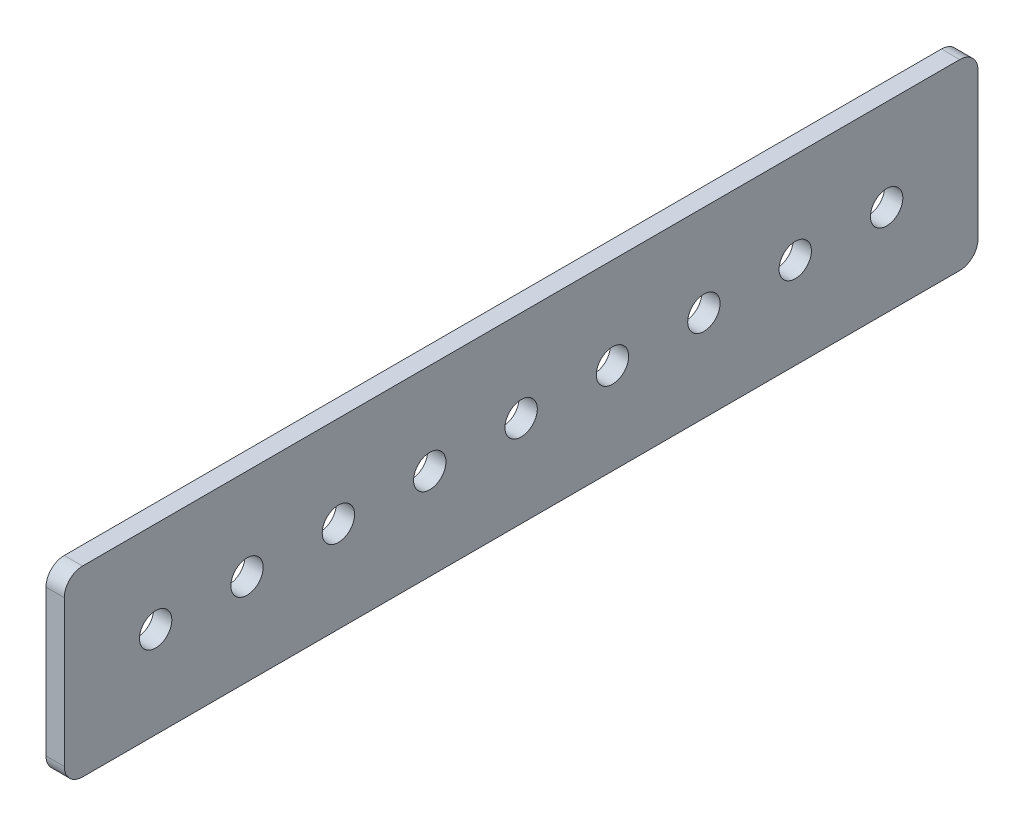
ISO-10303-21;
HEADER;
FILE_DESCRIPTION(('STEP AP214'),'2;1');
FILE_NAME('part.step','',(''),(''),'','','');
FILE_SCHEMA(('AUTOMOTIVE_DESIGN { 1 0 10303 214 1 1 1 1 }'));
ENDSEC;
DATA;
#1=APPLICATION_CONTEXT('core data for automotive mechanical design processes');
#2=APPLICATION_PROTOCOL_DEFINITION('international standard','automotive_design',2000,#1);
#3=PRODUCT_CONTEXT('',#1,'mechanical');
#4=PRODUCT('Part','Part','',(#3));
#5=PRODUCT_RELATED_PRODUCT_CATEGORY('part','',(#4));
#6=PRODUCT_DEFINITION_FORMATION('','',#4);
#7=PRODUCT_DEFINITION_CONTEXT('part definition',#1,'design');
#8=PRODUCT_DEFINITION('design','',#6,#7);
#9=PRODUCT_DEFINITION_SHAPE('','',#8);
#10=(LENGTH_UNIT() NAMED_UNIT(*) SI_UNIT(.MILLI.,.METRE.));
#11=(NAMED_UNIT(*) PLANE_ANGLE_UNIT() SI_UNIT($,.RADIAN.));
#12=(NAMED_UNIT(*) SI_UNIT($,.STERADIAN.) SOLID_ANGLE_UNIT());
#13=UNCERTAINTY_MEASURE_WITH_UNIT(LENGTH_MEASURE(1.E-05),#10,'distance_accuracy_value','');
#14=(GEOMETRIC_REPRESENTATION_CONTEXT(3) GLOBAL_UNCERTAINTY_ASSIGNED_CONTEXT((#13)) GLOBAL_UNIT_ASSIGNED_CONTEXT((#10,
#11,#12)) REPRESENTATION_CONTEXT('',''));
#15=CARTESIAN_POINT('',(0.,0.,0.));
#16=DIRECTION('',(0.,0.,1.));
#17=DIRECTION('',(1.,0.,0.));
#18=AXIS2_PLACEMENT_3D('',#15,#16,#17);
#19=CARTESIAN_POINT('',(2.54,-23.7489999999995,63.4999999999999));
#20=DIRECTION('',(0.,1.,0.));
#21=DIRECTION('',(0.,0.,1.));
#22=AXIS2_PLACEMENT_3D('',#19,#20,#21);
#23=PLANE('',#22);
#24=DIRECTION('',(0.,0.,-1.));
#25=VECTOR('',#24,1.);
#26=CARTESIAN_POINT('',(2.54,-23.7489999999995,63.4999999999999));
#27=LINE('',#26,#25);
#28=CARTESIAN_POINT('',(2.54,-23.7489999999995,60.9599999999999));
#29=VERTEX_POINT('',#28);
#30=CARTESIAN_POINT('',(2.54,-23.7489999999995,-60.9600000000001));
#31=VERTEX_POINT('',#30);
#32=EDGE_CURVE('E129',#29,#31,#27,.T.);
#33=ORIENTED_EDGE('',*,*,#32,.F.);
#34=DIRECTION('',(-1.,0.,0.));
#35=VECTOR('',#34,1.);
#36=CARTESIAN_POINT('',(0.,-23.7489999999995,60.9599999999999));
#37=LINE('',#36,#35);
#38=CARTESIAN_POINT('',(0.,-23.7489999999995,60.9599999999999));
#39=VERTEX_POINT('',#38);
#40=EDGE_CURVE('E159',#29,#39,#37,.T.);
#41=ORIENTED_EDGE('',*,*,#40,.T.);
#42=DIRECTION('',(0.,0.,-1.));
#43=VECTOR('',#42,1.);
#44=CARTESIAN_POINT('',(0.,-23.7489999999995,63.4999999999999));
#45=LINE('',#44,#43);
#46=CARTESIAN_POINT('',(0.,-23.7489999999995,-60.9600000000001));
#47=VERTEX_POINT('',#46);
#48=EDGE_CURVE('E112',#39,#47,#45,.T.);
#49=ORIENTED_EDGE('',*,*,#48,.T.);
#50=DIRECTION('',(-1.,0.,0.));
#51=VECTOR('',#50,1.);
#52=CARTESIAN_POINT('',(2.54,-23.7489999999995,-60.9600000000001));
#53=LINE('',#52,#51);
#54=EDGE_CURVE('E157',#47,#31,#53,.F.);
#55=ORIENTED_EDGE('',*,*,#54,.T.);
#56=EDGE_LOOP('',(#33,#41,#49,#55));
#57=FACE_BOUND('',#56,.T.);
#58=ADVANCED_FACE('F41',(#57),#23,.F.);
#59=CARTESIAN_POINT('',(2.54,-23.7489999999995,-63.5000000000001));
#60=DIRECTION('',(0.,0.,1.));
#61=DIRECTION('',(0.,-1.,0.));
#62=AXIS2_PLACEMENT_3D('',#59,#60,#61);
#63=PLANE('',#62);
#64=DIRECTION('',(0.,1.,0.));
#65=VECTOR('',#64,1.);
#66=CARTESIAN_POINT('',(2.54,-23.7489999999995,-63.5000000000001));
#67=LINE('',#66,#65);
#68=CARTESIAN_POINT('',(2.54,-21.2089999999995,-63.5000000000001));
#69=VERTEX_POINT('',#68);
#70=CARTESIAN_POINT('',(2.54,-0.888999999999522,-63.5000000000001));
#71=VERTEX_POINT('',#70);
#72=EDGE_CURVE('E164',#69,#71,#67,.T.);
#73=ORIENTED_EDGE('',*,*,#72,.F.);
#74=DIRECTION('',(-1.,0.,0.));
#75=VECTOR('',#74,1.);
#76=CARTESIAN_POINT('',(2.54,-21.2089999999995,-63.5000000000001));
#77=LINE('',#76,#75);
#78=CARTESIAN_POINT('',(0.,-21.2089999999995,-63.5000000000001));
#79=VERTEX_POINT('',#78);
#80=EDGE_CURVE('E11',#69,#79,#77,.T.);
#81=ORIENTED_EDGE('',*,*,#80,.T.);
#82=DIRECTION('',(0.,1.,0.));
#83=VECTOR('',#82,1.);
#84=CARTESIAN_POINT('',(0.,-23.7489999999995,-63.5000000000001));
#85=LINE('',#84,#83);
#86=CARTESIAN_POINT('',(0.,-0.888999999999522,-63.5000000000001));
#87=VERTEX_POINT('',#86);
#88=EDGE_CURVE('E178',#79,#87,#85,.T.);
#89=ORIENTED_EDGE('',*,*,#88,.T.);
#90=DIRECTION('',(-1.,0.,0.));
#91=VECTOR('',#90,1.);
#92=CARTESIAN_POINT('',(2.54,-0.888999999999515,-63.5000000000001));
#93=LINE('',#92,#91);
#94=EDGE_CURVE('E49',#87,#71,#93,.F.);
#95=ORIENTED_EDGE('',*,*,#94,.T.);
#96=EDGE_LOOP('',(#73,#81,#89,#95));
#97=FACE_BOUND('',#96,.T.);
#98=ADVANCED_FACE('F198',(#97),#63,.F.);
#99=CARTESIAN_POINT('',(2.54,1.65100000000048,-63.5000000000001));
#100=DIRECTION('',(0.,-1.,0.));
#101=DIRECTION('',(0.,0.,-1.));
#102=AXIS2_PLACEMENT_3D('',#99,#100,#101);
#103=PLANE('',#102);
#104=DIRECTION('',(0.,0.,1.));
#105=VECTOR('',#104,1.);
#106=CARTESIAN_POINT('',(0.,1.65100000000048,-63.5000000000001));
#107=LINE('',#106,#105);
#108=CARTESIAN_POINT('',(0.,1.65100000000048,-60.9600000000001));
#109=VERTEX_POINT('',#108);
#110=CARTESIAN_POINT('',(0.,1.65100000000048,60.9599999999999));
#111=VERTEX_POINT('',#110);
#112=EDGE_CURVE('E130',#109,#111,#107,.T.);
#113=ORIENTED_EDGE('',*,*,#112,.T.);
#114=DIRECTION('',(-1.,0.,0.));
#115=VECTOR('',#114,1.);
#116=CARTESIAN_POINT('',(2.54,1.65100000000048,60.9599999999999));
#117=LINE('',#116,#115);
#118=CARTESIAN_POINT('',(2.54,1.65100000000048,60.9599999999999));
#119=VERTEX_POINT('',#118);
#120=EDGE_CURVE('E149',#111,#119,#117,.F.);
#121=ORIENTED_EDGE('',*,*,#120,.T.);
#122=DIRECTION('',(0.,0.,1.));
#123=VECTOR('',#122,1.);
#124=CARTESIAN_POINT('',(2.54,1.65100000000048,-63.5000000000001));
#125=LINE('',#124,#123);
#126=CARTESIAN_POINT('',(2.54,1.65100000000048,-60.9600000000001));
#127=VERTEX_POINT('',#126);
#128=EDGE_CURVE('E139',#127,#119,#125,.T.);
#129=ORIENTED_EDGE('',*,*,#128,.F.);
#130=DIRECTION('',(-1.,0.,0.));
#131=VECTOR('',#130,1.);
#132=CARTESIAN_POINT('',(2.54,1.65100000000048,-60.9600000000001));
#133=LINE('',#132,#131);
#134=EDGE_CURVE('E146',#127,#109,#133,.T.);
#135=ORIENTED_EDGE('',*,*,#134,.T.);
#136=EDGE_LOOP('',(#113,#121,#129,#135));
#137=FACE_BOUND('',#136,.T.);
#138=ADVANCED_FACE('F188',(#137),#103,.F.);
#139=CARTESIAN_POINT('',(2.54,-23.7489999999995,63.4999999999999));
#140=DIRECTION('',(0.,0.,1.));
#141=DIRECTION('',(1.,0.,0.));
#142=AXIS2_PLACEMENT_3D('',#139,#140,#141);
#143=PLANE('',#142);
#144=DIRECTION('',(0.,1.,0.));
#145=VECTOR('',#144,1.);
#146=CARTESIAN_POINT('',(2.54,-23.7489999999995,63.4999999999999));
#147=LINE('',#146,#145);
#148=CARTESIAN_POINT('',(2.54,-21.2089999999995,63.4999999999999));
#149=VERTEX_POINT('',#148);
#150=CARTESIAN_POINT('',(2.54,-0.888999999999526,63.4999999999999));
#151=VERTEX_POINT('',#150);
#152=EDGE_CURVE('E135',#149,#151,#147,.T.);
#153=ORIENTED_EDGE('',*,*,#152,.T.);
#154=DIRECTION('',(-1.,0.,0.));
#155=VECTOR('',#154,1.);
#156=CARTESIAN_POINT('',(0.,-0.888999999999519,63.4999999999999));
#157=LINE('',#156,#155);
#158=CARTESIAN_POINT('',(0.,-0.888999999999526,63.4999999999999));
#159=VERTEX_POINT('',#158);
#160=EDGE_CURVE('E127',#151,#159,#157,.T.);
#161=ORIENTED_EDGE('',*,*,#160,.T.);
#162=DIRECTION('',(0.,1.,0.));
#163=VECTOR('',#162,1.);
#164=CARTESIAN_POINT('',(0.,-23.7489999999995,63.4999999999999));
#165=LINE('',#164,#163);
#166=CARTESIAN_POINT('',(0.,-21.2089999999995,63.4999999999999));
#167=VERTEX_POINT('',#166);
#168=EDGE_CURVE('E110',#167,#159,#165,.T.);
#169=ORIENTED_EDGE('',*,*,#168,.F.);
#170=DIRECTION('',(-1.,0.,0.));
#171=VECTOR('',#170,1.);
#172=CARTESIAN_POINT('',(2.54,-21.2089999999995,63.4999999999999));
#173=LINE('',#172,#171);
#174=EDGE_CURVE('E124',#167,#149,#173,.F.);
#175=ORIENTED_EDGE('',*,*,#174,.T.);
#176=EDGE_LOOP('',(#153,#161,#169,#175));
#177=FACE_BOUND('',#176,.T.);
#178=ADVANCED_FACE('F123',(#177),#143,.T.);
#179=CARTESIAN_POINT('',(2.54,0.,0.));
#180=DIRECTION('',(1.,0.,0.));
#181=DIRECTION('',(0.,0.,-1.));
#182=AXIS2_PLACEMENT_3D('',#179,#180,#181);
#183=PLANE('',#182);
#184=CARTESIAN_POINT('',(2.54,-11.0489999999995,-50.8000000000002));
#185=DIRECTION('',(-1.,0.,0.));
#186=DIRECTION('',(0.,0.,1.));
#187=AXIS2_PLACEMENT_3D('',#184,#185,#186);
#188=CIRCLE('',#187,2.2479);
#189=CARTESIAN_POINT('',(2.54,-11.0489999999995,-48.5521000000002));
#190=VERTEX_POINT('',#189);
#191=EDGE_CURVE('E458',#190,#190,#188,.T.);
#192=ORIENTED_EDGE('',*,*,#191,.T.);
#193=EDGE_LOOP('',(#192));
#194=FACE_BOUND('',#193,.T.);
#195=CARTESIAN_POINT('',(2.54,-11.0489999999995,-25.4000000000002));
#196=DIRECTION('',(-1.,0.,0.));
#197=DIRECTION('',(0.,0.,1.));
#198=AXIS2_PLACEMENT_3D('',#195,#196,#197);
#199=CIRCLE('',#198,2.2479);
#200=CARTESIAN_POINT('',(2.54,-11.0489999999995,-23.1521000000002));
#201=VERTEX_POINT('',#200);
#202=EDGE_CURVE('E452',#201,#201,#199,.T.);
#203=ORIENTED_EDGE('',*,*,#202,.T.);
#204=EDGE_LOOP('',(#203));
#205=FACE_BOUND('',#204,.T.);
#206=CARTESIAN_POINT('',(2.54,-11.0489999999995,-38.1000000000002));
#207=DIRECTION('',(-1.,0.,0.));
#208=DIRECTION('',(0.,0.,1.));
#209=AXIS2_PLACEMENT_3D('',#206,#207,#208);
#210=CIRCLE('',#209,2.2479);
#211=CARTESIAN_POINT('',(2.54,-11.0489999999995,-35.8521000000002));
#212=VERTEX_POINT('',#211);
#213=EDGE_CURVE('E446',#212,#212,#210,.T.);
#214=ORIENTED_EDGE('',*,*,#213,.T.);
#215=EDGE_LOOP('',(#214));
#216=FACE_BOUND('',#215,.T.);
#217=CARTESIAN_POINT('',(2.54,-11.0489999999995,-1.0321604682062E-13));
#218=DIRECTION('',(-1.,0.,0.));
#219=DIRECTION('',(0.,0.,1.));
#220=AXIS2_PLACEMENT_3D('',#217,#218,#219);
#221=CIRCLE('',#220,2.2479);
#222=CARTESIAN_POINT('',(2.54,-11.0489999999995,2.24789999999989));
#223=VERTEX_POINT('',#222);
#224=EDGE_CURVE('E440',#223,#223,#221,.T.);
#225=ORIENTED_EDGE('',*,*,#224,.T.);
#226=EDGE_LOOP('',(#225));
#227=FACE_BOUND('',#226,.T.);
#228=CARTESIAN_POINT('',(2.54,-11.0489999999995,25.3999999999999));
#229=DIRECTION('',(-1.,0.,0.));
#230=DIRECTION('',(0.,0.,1.));
#231=AXIS2_PLACEMENT_3D('',#228,#229,#230);
#232=CIRCLE('',#231,2.2479);
#233=CARTESIAN_POINT('',(2.54,-11.0489999999995,27.6478999999999));
#234=VERTEX_POINT('',#233);
#235=EDGE_CURVE('E436',#234,#234,#232,.T.);
#236=ORIENTED_EDGE('',*,*,#235,.T.);
#237=EDGE_LOOP('',(#236));
#238=FACE_BOUND('',#237,.T.);
#239=CARTESIAN_POINT('',(2.54,-11.0489999999995,50.7999999999999));
#240=DIRECTION('',(-1.,0.,0.));
#241=DIRECTION('',(0.,0.,1.));
#242=AXIS2_PLACEMENT_3D('',#239,#240,#241);
#243=CIRCLE('',#242,2.2479);
#244=CARTESIAN_POINT('',(2.54,-11.0489999999995,53.0478999999998));
#245=VERTEX_POINT('',#244);
#246=EDGE_CURVE('E432',#245,#245,#243,.T.);
#247=ORIENTED_EDGE('',*,*,#246,.T.);
#248=EDGE_LOOP('',(#247));
#249=FACE_BOUND('',#248,.T.);
#250=CARTESIAN_POINT('',(2.54,-11.0489999999995,-12.7000000000002));
#251=DIRECTION('',(-1.,0.,0.));
#252=DIRECTION('',(0.,0.,1.));
#253=AXIS2_PLACEMENT_3D('',#250,#251,#252);
#254=CIRCLE('',#253,2.2479);
#255=CARTESIAN_POINT('',(2.54,-11.0489999999995,-10.4521000000002));
#256=VERTEX_POINT('',#255);
#257=EDGE_CURVE('E426',#256,#256,#254,.T.);
#258=ORIENTED_EDGE('',*,*,#257,.T.);
#259=EDGE_LOOP('',(#258));
#260=FACE_BOUND('',#259,.T.);
#261=CARTESIAN_POINT('',(2.54,-11.0489999999995,12.6999999999998));
#262=DIRECTION('',(-1.,0.,0.));
#263=DIRECTION('',(0.,0.,1.));
#264=AXIS2_PLACEMENT_3D('',#261,#262,#263);
#265=CIRCLE('',#264,2.2479);
#266=CARTESIAN_POINT('',(2.54,-11.0489999999995,14.9478999999998));
#267=VERTEX_POINT('',#266);
#268=EDGE_CURVE('E418',#267,#267,#265,.T.);
#269=ORIENTED_EDGE('',*,*,#268,.T.);
#270=EDGE_LOOP('',(#269));
#271=FACE_BOUND('',#270,.T.);
#272=CARTESIAN_POINT('',(2.54,-11.0489999999995,38.0999999999998));
#273=DIRECTION('',(-1.,0.,0.));
#274=DIRECTION('',(0.,0.,1.));
#275=AXIS2_PLACEMENT_3D('',#272,#273,#274);
#276=CIRCLE('',#275,2.2479);
#277=CARTESIAN_POINT('',(2.54,-11.0489999999995,40.3478999999998));
#278=VERTEX_POINT('',#277);
#279=EDGE_CURVE('E171',#278,#278,#276,.T.);
#280=ORIENTED_EDGE('',*,*,#279,.T.);
#281=EDGE_LOOP('',(#280));
#282=FACE_BOUND('',#281,.T.);
#283=ORIENTED_EDGE('',*,*,#128,.T.);
#284=CARTESIAN_POINT('',(2.54,-0.888999999999519,60.9599999999999));
#285=DIRECTION('',(1.,0.,0.));
#286=DIRECTION('',(0.,0.,-1.));
#287=AXIS2_PLACEMENT_3D('',#284,#285,#286);
#288=CIRCLE('',#287,2.54);
#289=EDGE_CURVE('E155',#119,#151,#288,.T.);
#290=ORIENTED_EDGE('',*,*,#289,.T.);
#291=ORIENTED_EDGE('',*,*,#152,.F.);
#292=CARTESIAN_POINT('',(2.54,-21.2089999999995,60.9599999999999));
#293=DIRECTION('',(1.,0.,0.));
#294=DIRECTION('',(0.,0.,-1.));
#295=AXIS2_PLACEMENT_3D('',#292,#293,#294);
#296=CIRCLE('',#295,2.54);
#297=EDGE_CURVE('E134',#149,#29,#296,.T.);
#298=ORIENTED_EDGE('',*,*,#297,.T.);
#299=ORIENTED_EDGE('',*,*,#32,.T.);
#300=CARTESIAN_POINT('',(2.54,-21.2089999999995,-60.9600000000001));
#301=DIRECTION('',(1.,0.,0.));
#302=DIRECTION('',(0.,0.,-1.));
#303=AXIS2_PLACEMENT_3D('',#300,#301,#302);
#304=CIRCLE('',#303,2.54);
#305=EDGE_CURVE('E62',#31,#69,#304,.T.);
#306=ORIENTED_EDGE('',*,*,#305,.T.);
#307=ORIENTED_EDGE('',*,*,#72,.T.);
#308=CARTESIAN_POINT('',(2.54,-0.888999999999518,-60.9600000000001));
#309=DIRECTION('',(1.,0.,0.));
#310=DIRECTION('',(0.,0.,-1.));
#311=AXIS2_PLACEMENT_3D('',#308,#309,#310);
#312=CIRCLE('',#311,2.54);
#313=EDGE_CURVE('E151',#71,#127,#312,.T.);
#314=ORIENTED_EDGE('',*,*,#313,.T.);
#315=EDGE_LOOP('',(#283,#290,#291,#298,#299,#306,#307,#314));
#316=FACE_BOUND('',#315,.T.);
#317=ADVANCED_FACE('F194',(#194,#205,#216,#227,#238,#249,#260,#271,#282,#316),#183,.T.);
#318=CARTESIAN_POINT('',(0.,0.,0.));
#319=DIRECTION('',(1.,0.,0.));
#320=DIRECTION('',(0.,0.,-1.));
#321=AXIS2_PLACEMENT_3D('',#318,#319,#320);
#322=PLANE('',#321);
#323=CARTESIAN_POINT('',(0.,-11.0489999999995,-50.8000000000002));
#324=DIRECTION('',(-1.,0.,0.));
#325=DIRECTION('',(0.,0.,1.));
#326=AXIS2_PLACEMENT_3D('',#323,#324,#325);
#327=CIRCLE('',#326,2.24789999999999);
#328=CARTESIAN_POINT('',(0.,-11.0489999999995,-48.5521000000002));
#329=VERTEX_POINT('',#328);
#330=EDGE_CURVE('E385',#329,#329,#327,.T.);
#331=ORIENTED_EDGE('',*,*,#330,.F.);
#332=EDGE_LOOP('',(#331));
#333=FACE_BOUND('',#332,.T.);
#334=CARTESIAN_POINT('',(0.,-11.0489999999995,-25.4000000000002));
#335=DIRECTION('',(-1.,0.,0.));
#336=DIRECTION('',(0.,0.,1.));
#337=AXIS2_PLACEMENT_3D('',#334,#335,#336);
#338=CIRCLE('',#337,2.24789999999999);
#339=CARTESIAN_POINT('',(0.,-11.0489999999995,-23.1521000000002));
#340=VERTEX_POINT('',#339);
#341=EDGE_CURVE('E389',#340,#340,#338,.T.);
#342=ORIENTED_EDGE('',*,*,#341,.F.);
#343=EDGE_LOOP('',(#342));
#344=FACE_BOUND('',#343,.T.);
#345=CARTESIAN_POINT('',(0.,-11.0489999999995,-38.1000000000002));
#346=DIRECTION('',(-1.,0.,0.));
#347=DIRECTION('',(0.,0.,1.));
#348=AXIS2_PLACEMENT_3D('',#345,#346,#347);
#349=CIRCLE('',#348,2.24789999999999);
#350=CARTESIAN_POINT('',(0.,-11.0489999999995,-35.8521000000002));
#351=VERTEX_POINT('',#350);
#352=EDGE_CURVE('E393',#351,#351,#349,.T.);
#353=ORIENTED_EDGE('',*,*,#352,.F.);
#354=EDGE_LOOP('',(#353));
#355=FACE_BOUND('',#354,.T.);
#356=CARTESIAN_POINT('',(0.,-11.0489999999995,-1.0321604682062E-13));
#357=DIRECTION('',(-1.,0.,0.));
#358=DIRECTION('',(0.,0.,1.));
#359=AXIS2_PLACEMENT_3D('',#356,#357,#358);
#360=CIRCLE('',#359,2.24789999999999);
#361=CARTESIAN_POINT('',(0.,-11.0489999999995,2.24789999999988));
#362=VERTEX_POINT('',#361);
#363=EDGE_CURVE('E397',#362,#362,#360,.T.);
#364=ORIENTED_EDGE('',*,*,#363,.F.);
#365=EDGE_LOOP('',(#364));
#366=FACE_BOUND('',#365,.T.);
#367=CARTESIAN_POINT('',(0.,-11.0489999999995,25.3999999999999));
#368=DIRECTION('',(-1.,0.,0.));
#369=DIRECTION('',(0.,0.,1.));
#370=AXIS2_PLACEMENT_3D('',#367,#368,#369);
#371=CIRCLE('',#370,2.24789999999999);
#372=CARTESIAN_POINT('',(0.,-11.0489999999995,27.6478999999999));
#373=VERTEX_POINT('',#372);
#374=EDGE_CURVE('E401',#373,#373,#371,.T.);
#375=ORIENTED_EDGE('',*,*,#374,.F.);
#376=EDGE_LOOP('',(#375));
#377=FACE_BOUND('',#376,.T.);
#378=CARTESIAN_POINT('',(0.,-11.0489999999995,50.7999999999999));
#379=DIRECTION('',(-1.,0.,0.));
#380=DIRECTION('',(0.,0.,1.));
#381=AXIS2_PLACEMENT_3D('',#378,#379,#380);
#382=CIRCLE('',#381,2.24789999999999);
#383=CARTESIAN_POINT('',(0.,-11.0489999999995,53.0478999999998));
#384=VERTEX_POINT('',#383);
#385=EDGE_CURVE('E405',#384,#384,#382,.T.);
#386=ORIENTED_EDGE('',*,*,#385,.F.);
#387=EDGE_LOOP('',(#386));
#388=FACE_BOUND('',#387,.T.);
#389=CARTESIAN_POINT('',(0.,-11.0489999999995,-12.7000000000002));
#390=DIRECTION('',(-1.,0.,0.));
#391=DIRECTION('',(0.,0.,1.));
#392=AXIS2_PLACEMENT_3D('',#389,#390,#391);
#393=CIRCLE('',#392,2.24789999999999);
#394=CARTESIAN_POINT('',(0.,-11.0489999999995,-10.4521000000002));
#395=VERTEX_POINT('',#394);
#396=EDGE_CURVE('E409',#395,#395,#393,.T.);
#397=ORIENTED_EDGE('',*,*,#396,.F.);
#398=EDGE_LOOP('',(#397));
#399=FACE_BOUND('',#398,.T.);
#400=CARTESIAN_POINT('',(0.,-11.0489999999995,12.6999999999998));
#401=DIRECTION('',(-1.,0.,0.));
#402=DIRECTION('',(0.,0.,1.));
#403=AXIS2_PLACEMENT_3D('',#400,#401,#402);
#404=CIRCLE('',#403,2.24789999999999);
#405=CARTESIAN_POINT('',(0.,-11.0489999999995,14.9478999999998));
#406=VERTEX_POINT('',#405);
#407=EDGE_CURVE('E413',#406,#406,#404,.T.);
#408=ORIENTED_EDGE('',*,*,#407,.F.);
#409=EDGE_LOOP('',(#408));
#410=FACE_BOUND('',#409,.T.);
#411=CARTESIAN_POINT('',(0.,-11.0489999999995,38.0999999999998));
#412=DIRECTION('',(-1.,0.,0.));
#413=DIRECTION('',(0.,0.,1.));
#414=AXIS2_PLACEMENT_3D('',#411,#412,#413);
#415=CIRCLE('',#414,2.24789999999999);
#416=CARTESIAN_POINT('',(0.,-11.0489999999995,40.3478999999998));
#417=VERTEX_POINT('',#416);
#418=EDGE_CURVE('E416',#417,#417,#415,.T.);
#419=ORIENTED_EDGE('',*,*,#418,.F.);
#420=EDGE_LOOP('',(#419));
#421=FACE_BOUND('',#420,.T.);
#422=ORIENTED_EDGE('',*,*,#168,.T.);
#423=CARTESIAN_POINT('',(0.,-0.888999999999519,60.9599999999999));
#424=DIRECTION('',(1.,0.,0.));
#425=DIRECTION('',(0.,0.,-1.));
#426=AXIS2_PLACEMENT_3D('',#423,#424,#425);
#427=CIRCLE('',#426,2.54);
#428=EDGE_CURVE('E117',#159,#111,#427,.F.);
#429=ORIENTED_EDGE('',*,*,#428,.T.);
#430=ORIENTED_EDGE('',*,*,#112,.F.);
#431=CARTESIAN_POINT('',(0.,-0.888999999999518,-60.9600000000001));
#432=DIRECTION('',(1.,0.,0.));
#433=DIRECTION('',(0.,0.,-1.));
#434=AXIS2_PLACEMENT_3D('',#431,#432,#433);
#435=CIRCLE('',#434,2.54);
#436=EDGE_CURVE('E137',#109,#87,#435,.F.);
#437=ORIENTED_EDGE('',*,*,#436,.T.);
#438=ORIENTED_EDGE('',*,*,#88,.F.);
#439=CARTESIAN_POINT('',(0.,-21.2089999999995,-60.9600000000001));
#440=DIRECTION('',(1.,0.,0.));
#441=DIRECTION('',(0.,0.,-1.));
#442=AXIS2_PLACEMENT_3D('',#439,#440,#441);
#443=CIRCLE('',#442,2.54);
#444=EDGE_CURVE('E118',#79,#47,#443,.F.);
#445=ORIENTED_EDGE('',*,*,#444,.T.);
#446=ORIENTED_EDGE('',*,*,#48,.F.);
#447=CARTESIAN_POINT('',(0.,-21.2089999999995,60.9599999999999));
#448=DIRECTION('',(1.,0.,0.));
#449=DIRECTION('',(0.,0.,-1.));
#450=AXIS2_PLACEMENT_3D('',#447,#448,#449);
#451=CIRCLE('',#450,2.54);
#452=EDGE_CURVE('E107',#39,#167,#451,.F.);
#453=ORIENTED_EDGE('',*,*,#452,.T.);
#454=EDGE_LOOP('',(#422,#429,#430,#437,#438,#445,#446,#453));
#455=FACE_BOUND('',#454,.T.);
#456=ADVANCED_FACE('F109',(#333,#344,#355,#366,#377,#388,#399,#410,#421,#455),#322,.F.);
#457=CARTESIAN_POINT('',(0.,-11.0489999999995,38.0999999999998));
#458=DIRECTION('',(-1.,0.,0.));
#459=DIRECTION('',(0.,0.,1.));
#460=AXIS2_PLACEMENT_3D('',#457,#458,#459);
#461=CYLINDRICAL_SURFACE('',#460,2.24789999999999);
#462=ORIENTED_EDGE('',*,*,#279,.F.);
#463=EDGE_LOOP('',(#462));
#464=FACE_BOUND('',#463,.T.);
#465=ORIENTED_EDGE('',*,*,#418,.T.);
#466=EDGE_LOOP('',(#465));
#467=FACE_BOUND('',#466,.T.);
#468=ADVANCED_FACE('F255',(#464,#467),#461,.F.);
#469=CARTESIAN_POINT('',(0.,-11.0489999999995,12.6999999999998));
#470=DIRECTION('',(-1.,0.,0.));
#471=DIRECTION('',(0.,0.,1.));
#472=AXIS2_PLACEMENT_3D('',#469,#470,#471);
#473=CYLINDRICAL_SURFACE('',#472,2.24789999999999);
#474=ORIENTED_EDGE('',*,*,#268,.F.);
#475=EDGE_LOOP('',(#474));
#476=FACE_BOUND('',#475,.T.);
#477=ORIENTED_EDGE('',*,*,#407,.T.);
#478=EDGE_LOOP('',(#477));
#479=FACE_BOUND('',#478,.T.);
#480=ADVANCED_FACE('F251',(#476,#479),#473,.F.);
#481=CARTESIAN_POINT('',(0.,-11.0489999999995,-12.7000000000002));
#482=DIRECTION('',(-1.,0.,0.));
#483=DIRECTION('',(0.,0.,1.));
#484=AXIS2_PLACEMENT_3D('',#481,#482,#483);
#485=CYLINDRICAL_SURFACE('',#484,2.24789999999999);
#486=ORIENTED_EDGE('',*,*,#257,.F.);
#487=EDGE_LOOP('',(#486));
#488=FACE_BOUND('',#487,.T.);
#489=ORIENTED_EDGE('',*,*,#396,.T.);
#490=EDGE_LOOP('',(#489));
#491=FACE_BOUND('',#490,.T.);
#492=ADVANCED_FACE('F247',(#488,#491),#485,.F.);
#493=CARTESIAN_POINT('',(0.,-11.0489999999995,50.7999999999999));
#494=DIRECTION('',(-1.,0.,0.));
#495=DIRECTION('',(0.,0.,1.));
#496=AXIS2_PLACEMENT_3D('',#493,#494,#495);
#497=CYLINDRICAL_SURFACE('',#496,2.24789999999999);
#498=ORIENTED_EDGE('',*,*,#246,.F.);
#499=EDGE_LOOP('',(#498));
#500=FACE_BOUND('',#499,.T.);
#501=ORIENTED_EDGE('',*,*,#385,.T.);
#502=EDGE_LOOP('',(#501));
#503=FACE_BOUND('',#502,.T.);
#504=ADVANCED_FACE('F243',(#500,#503),#497,.F.);
#505=CARTESIAN_POINT('',(0.,-11.0489999999995,25.3999999999999));
#506=DIRECTION('',(-1.,0.,0.));
#507=DIRECTION('',(0.,0.,1.));
#508=AXIS2_PLACEMENT_3D('',#505,#506,#507);
#509=CYLINDRICAL_SURFACE('',#508,2.24789999999999);
#510=ORIENTED_EDGE('',*,*,#235,.F.);
#511=EDGE_LOOP('',(#510));
#512=FACE_BOUND('',#511,.T.);
#513=ORIENTED_EDGE('',*,*,#374,.T.);
#514=EDGE_LOOP('',(#513));
#515=FACE_BOUND('',#514,.T.);
#516=ADVANCED_FACE('F239',(#512,#515),#509,.F.);
#517=CARTESIAN_POINT('',(0.,-11.0489999999995,-1.0321604682062E-13));
#518=DIRECTION('',(-1.,0.,0.));
#519=DIRECTION('',(0.,0.,1.));
#520=AXIS2_PLACEMENT_3D('',#517,#518,#519);
#521=CYLINDRICAL_SURFACE('',#520,2.24789999999999);
#522=ORIENTED_EDGE('',*,*,#224,.F.);
#523=EDGE_LOOP('',(#522));
#524=FACE_BOUND('',#523,.T.);
#525=ORIENTED_EDGE('',*,*,#363,.T.);
#526=EDGE_LOOP('',(#525));
#527=FACE_BOUND('',#526,.T.);
#528=ADVANCED_FACE('F235',(#524,#527),#521,.F.);
#529=CARTESIAN_POINT('',(0.,-11.0489999999995,-38.1000000000002));
#530=DIRECTION('',(-1.,0.,0.));
#531=DIRECTION('',(0.,0.,1.));
#532=AXIS2_PLACEMENT_3D('',#529,#530,#531);
#533=CYLINDRICAL_SURFACE('',#532,2.24789999999999);
#534=ORIENTED_EDGE('',*,*,#213,.F.);
#535=EDGE_LOOP('',(#534));
#536=FACE_BOUND('',#535,.T.);
#537=ORIENTED_EDGE('',*,*,#352,.T.);
#538=EDGE_LOOP('',(#537));
#539=FACE_BOUND('',#538,.T.);
#540=ADVANCED_FACE('F227',(#536,#539),#533,.F.);
#541=CARTESIAN_POINT('',(0.,-11.0489999999995,-25.4000000000002));
#542=DIRECTION('',(-1.,0.,0.));
#543=DIRECTION('',(0.,0.,1.));
#544=AXIS2_PLACEMENT_3D('',#541,#542,#543);
#545=CYLINDRICAL_SURFACE('',#544,2.24789999999999);
#546=ORIENTED_EDGE('',*,*,#202,.F.);
#547=EDGE_LOOP('',(#546));
#548=FACE_BOUND('',#547,.T.);
#549=ORIENTED_EDGE('',*,*,#341,.T.);
#550=EDGE_LOOP('',(#549));
#551=FACE_BOUND('',#550,.T.);
#552=ADVANCED_FACE('F221',(#548,#551),#545,.F.);
#553=CARTESIAN_POINT('',(0.,-11.0489999999995,-50.8000000000002));
#554=DIRECTION('',(-1.,0.,0.));
#555=DIRECTION('',(0.,0.,1.));
#556=AXIS2_PLACEMENT_3D('',#553,#554,#555);
#557=CYLINDRICAL_SURFACE('',#556,2.24789999999999);
#558=ORIENTED_EDGE('',*,*,#191,.F.);
#559=EDGE_LOOP('',(#558));
#560=FACE_BOUND('',#559,.T.);
#561=ORIENTED_EDGE('',*,*,#330,.T.);
#562=EDGE_LOOP('',(#561));
#563=FACE_BOUND('',#562,.T.);
#564=ADVANCED_FACE('F217',(#560,#563),#557,.F.);
#565=CARTESIAN_POINT('',(2.54,-0.888999999999519,60.9599999999999));
#566=DIRECTION('',(1.,0.,0.));
#567=DIRECTION('',(0.,0.,-1.));
#568=AXIS2_PLACEMENT_3D('',#565,#566,#567);
#569=CYLINDRICAL_SURFACE('',#568,2.54);
#570=ORIENTED_EDGE('',*,*,#289,.F.);
#571=ORIENTED_EDGE('',*,*,#120,.F.);
#572=ORIENTED_EDGE('',*,*,#428,.F.);
#573=ORIENTED_EDGE('',*,*,#160,.F.);
#574=EDGE_LOOP('',(#570,#571,#572,#573));
#575=FACE_BOUND('',#574,.T.);
#576=ADVANCED_FACE('F193',(#575),#569,.T.);
#577=CARTESIAN_POINT('',(2.54,-21.2089999999995,60.9599999999999));
#578=DIRECTION('',(1.,0.,0.));
#579=DIRECTION('',(0.,0.,-1.));
#580=AXIS2_PLACEMENT_3D('',#577,#578,#579);
#581=CYLINDRICAL_SURFACE('',#580,2.54);
#582=ORIENTED_EDGE('',*,*,#297,.F.);
#583=ORIENTED_EDGE('',*,*,#174,.F.);
#584=ORIENTED_EDGE('',*,*,#452,.F.);
#585=ORIENTED_EDGE('',*,*,#40,.F.);
#586=EDGE_LOOP('',(#582,#583,#584,#585));
#587=FACE_BOUND('',#586,.T.);
#588=ADVANCED_FACE('F133',(#587),#581,.T.);
#589=CARTESIAN_POINT('',(2.54,-21.2089999999995,-60.9600000000001));
#590=DIRECTION('',(-1.,0.,0.));
#591=DIRECTION('',(0.,0.,1.));
#592=AXIS2_PLACEMENT_3D('',#589,#590,#591);
#593=CYLINDRICAL_SURFACE('',#592,2.54);
#594=ORIENTED_EDGE('',*,*,#305,.F.);
#595=ORIENTED_EDGE('',*,*,#54,.F.);
#596=ORIENTED_EDGE('',*,*,#444,.F.);
#597=ORIENTED_EDGE('',*,*,#80,.F.);
#598=EDGE_LOOP('',(#594,#595,#596,#597));
#599=FACE_BOUND('',#598,.T.);
#600=ADVANCED_FACE('F201',(#599),#593,.T.);
#601=CARTESIAN_POINT('',(2.54,-0.888999999999518,-60.9600000000001));
#602=DIRECTION('',(-1.,0.,0.));
#603=DIRECTION('',(0.,0.,1.));
#604=AXIS2_PLACEMENT_3D('',#601,#602,#603);
#605=CYLINDRICAL_SURFACE('',#604,2.54);
#606=ORIENTED_EDGE('',*,*,#313,.F.);
#607=ORIENTED_EDGE('',*,*,#94,.F.);
#608=ORIENTED_EDGE('',*,*,#436,.F.);
#609=ORIENTED_EDGE('',*,*,#134,.F.);
#610=EDGE_LOOP('',(#606,#607,#608,#609));
#611=FACE_BOUND('',#610,.T.);
#612=ADVANCED_FACE('F43',(#611),#605,.T.);
#613=CLOSED_SHELL('',(#58,#98,#138,#178,#317,#456,#468,#480,#492,#504,#516,#528,#540,#552,#564,
#576,#588,#600,#612));
#614=MANIFOLD_SOLID_BREP('B2',#613);
#615=ADVANCED_BREP_SHAPE_REPRESENTATION('',(#18,#614),#14);
#616=SHAPE_DEFINITION_REPRESENTATION(#9,#615);
ENDSEC;
END-ISO-10303-21;
